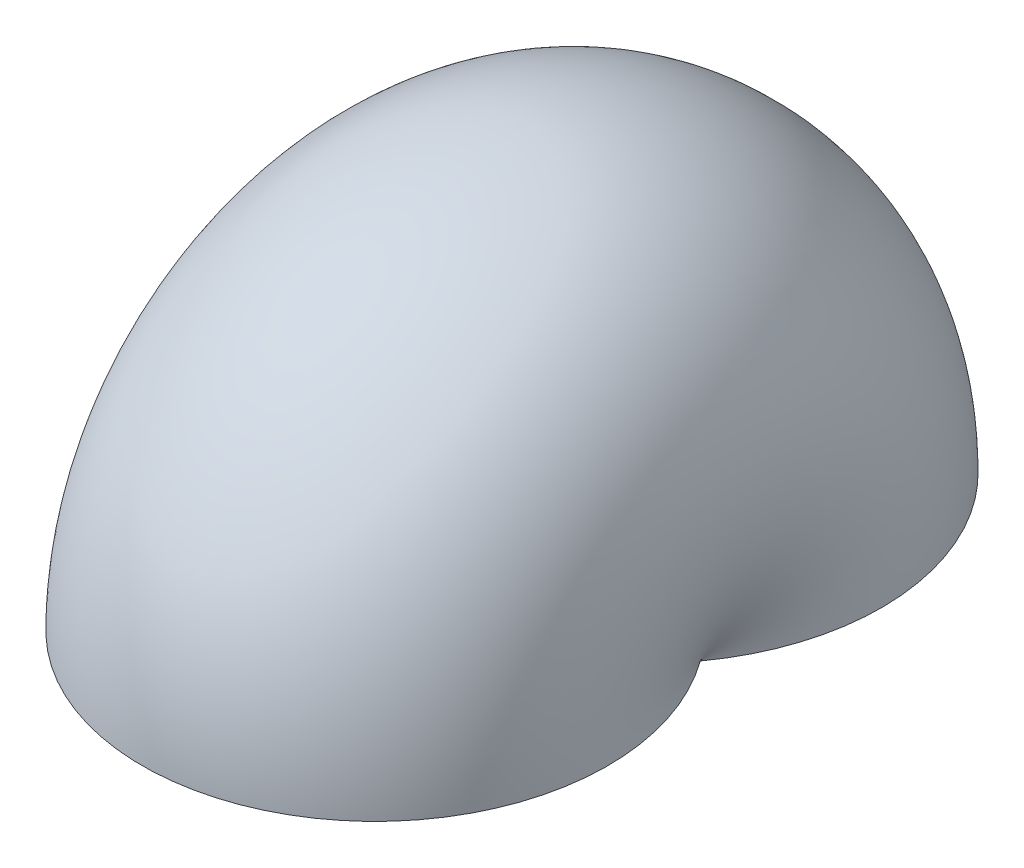
ISO-10303-21;
HEADER;
FILE_DESCRIPTION(('STEP AP214'),'2;1');
FILE_NAME('part.step','',(''),(''),'','','');
FILE_SCHEMA(('AUTOMOTIVE_DESIGN { 1 0 10303 214 1 1 1 1 }'));
ENDSEC;
DATA;
#1=APPLICATION_CONTEXT('core data for automotive mechanical design processes');
#2=APPLICATION_PROTOCOL_DEFINITION('international standard','automotive_design',2000,#1);
#3=PRODUCT_CONTEXT('',#1,'mechanical');
#4=PRODUCT('Part','Part','',(#3));
#5=PRODUCT_RELATED_PRODUCT_CATEGORY('part','',(#4));
#6=PRODUCT_DEFINITION_FORMATION('','',#4);
#7=PRODUCT_DEFINITION_CONTEXT('part definition',#1,'design');
#8=PRODUCT_DEFINITION('design','',#6,#7);
#9=PRODUCT_DEFINITION_SHAPE('','',#8);
#10=(LENGTH_UNIT() NAMED_UNIT(*) SI_UNIT(.MILLI.,.METRE.));
#11=(NAMED_UNIT(*) PLANE_ANGLE_UNIT() SI_UNIT($,.RADIAN.));
#12=(NAMED_UNIT(*) SI_UNIT($,.STERADIAN.) SOLID_ANGLE_UNIT());
#13=UNCERTAINTY_MEASURE_WITH_UNIT(LENGTH_MEASURE(1.E-05),#10,'distance_accuracy_value','');
#14=(GEOMETRIC_REPRESENTATION_CONTEXT(3) GLOBAL_UNCERTAINTY_ASSIGNED_CONTEXT((#13)) GLOBAL_UNIT_ASSIGNED_CONTEXT((#10,
#11,#12)) REPRESENTATION_CONTEXT('',''));
#15=CARTESIAN_POINT('',(0.,0.,0.));
#16=DIRECTION('',(0.,0.,1.));
#17=DIRECTION('',(1.,0.,0.));
#18=AXIS2_PLACEMENT_3D('',#15,#16,#17);
#19=CARTESIAN_POINT('',(0.,5.58637014214901E-13,-160.));
#20=DIRECTION('',(0.,-1.,0.));
#21=DIRECTION('',(0.,0.,-1.));
#22=AXIS2_PLACEMENT_3D('',#19,#20,#21);
#23=PLANE('',#22);
#24=CARTESIAN_POINT('',(0.,1.1172740284298E-12,-160.));
#25=DIRECTION('',(0.,-1.,0.));
#26=DIRECTION('',(0.,0.,-1.));
#27=AXIS2_PLACEMENT_3D('',#24,#25,#26);
#28=CIRCLE('',#27,135.93);
#29=CARTESIAN_POINT('',(109.895245120069,5.586367126632E-13,-80.));
#30=VERTEX_POINT('',#29);
#31=CARTESIAN_POINT('',(-109.895245120069,0.,-79.9999999999999));
#32=VERTEX_POINT('',#31);
#33=EDGE_CURVE('E11',#30,#32,#28,.T.);
#34=ORIENTED_EDGE('',*,*,#33,.F.);
#35=CARTESIAN_POINT('',(0.,-5.58637014214901E-13,0.));
#36=DIRECTION('',(0.,-1.,0.));
#37=DIRECTION('',(0.,0.,-1.));
#38=AXIS2_PLACEMENT_3D('',#35,#36,#37);
#39=CIRCLE('',#38,135.93);
#40=EDGE_CURVE('E56',#30,#32,#39,.T.);
#41=ORIENTED_EDGE('',*,*,#40,.T.);
#42=EDGE_LOOP('',(#34,#41));
#43=FACE_BOUND('',#42,.T.);
#44=ADVANCED_FACE('F38',(#43),#23,.T.);
#45=CARTESIAN_POINT('',(0.,0.,0.));
#46=DIRECTION('',(0.,-1.,0.));
#47=DIRECTION('',(0.,0.,1.));
#48=AXIS2_PLACEMENT_3D('',#45,#46,#47);
#49=CIRCLE('',#48,135.93);
#50=TRIMMED_CURVE('',#49,(PARAMETER_VALUE(-2.20004588958551)),
(PARAMETER_VALUE(2.20004588958551)),.T.,.PARAMETER.);
#51=CARTESIAN_POINT('',(0.,0.,-80.));
#52=DIRECTION('',(-1.,0.,0.));
#53=AXIS1_PLACEMENT('',#51,#52);
#54=SURFACE_OF_REVOLUTION('',#50,#53);
#55=CARTESIAN_POINT('',(0.,0.,-160.));
#56=DIRECTION('',(0.,1.,0.));
#57=DIRECTION('',(0.,0.,1.));
#58=AXIS2_PLACEMENT_3D('',#55,#56,#57);
#59=CIRCLE('',#58,135.93);
#60=EDGE_CURVE('E60',#30,#32,#59,.T.);
#61=ORIENTED_EDGE('',*,*,#60,.T.);
#62=ORIENTED_EDGE('',*,*,#40,.F.);
#63=EDGE_LOOP('',(#61,#62));
#64=FACE_BOUND('',#63,.T.);
#65=ADVANCED_FACE('F40',(#64),#54,.T.);
#66=CARTESIAN_POINT('',(0.,0.,0.));
#67=DIRECTION('',(0.,-1.,0.));
#68=DIRECTION('',(0.,0.,-1.));
#69=AXIS2_PLACEMENT_3D('',#66,#67,#68);
#70=CIRCLE('',#69,135.93);
#71=EDGE_CURVE('E46',#32,#30,#70,.T.);
#72=ORIENTED_EDGE('',*,*,#71,.F.);
#73=ORIENTED_EDGE('',*,*,#60,.F.);
#74=EDGE_LOOP('',(#72,#73));
#75=FACE_BOUND('',#74,.T.);
#76=ADVANCED_FACE('F61',(#75),#23,.T.);
#77=CARTESIAN_POINT('',(0.,5.58637014214901E-13,-160.));
#78=DIRECTION('',(0.,-1.,0.));
#79=DIRECTION('',(0.,0.,1.));
#80=AXIS2_PLACEMENT_3D('',#77,#78,#79);
#81=CIRCLE('',#80,135.93);
#82=TRIMMED_CURVE('',#81,(PARAMETER_VALUE(-0.94154676400428)),
(PARAMETER_VALUE(0.94154676400428)),.T.,.PARAMETER.);
#83=CARTESIAN_POINT('',(0.,5.58637014214901E-13,-79.9999999999999));
#84=DIRECTION('',(-1.,0.,0.));
#85=AXIS1_PLACEMENT('',#83,#84);
#86=SURFACE_OF_REVOLUTION('',#82,#85);
#87=ORIENTED_EDGE('',*,*,#33,.T.);
#88=ORIENTED_EDGE('',*,*,#71,.T.);
#89=EDGE_LOOP('',(#87,#88));
#90=FACE_BOUND('',#89,.T.);
#91=ADVANCED_FACE('F52',(#90),#86,.F.);
#92=CLOSED_SHELL('',(#44,#65,#76,#91));
#93=MANIFOLD_SOLID_BREP('B2',#92);
#94=ADVANCED_BREP_SHAPE_REPRESENTATION('',(#18,#93),#14);
#95=SHAPE_DEFINITION_REPRESENTATION(#9,#94);
ENDSEC;
END-ISO-10303-21;
